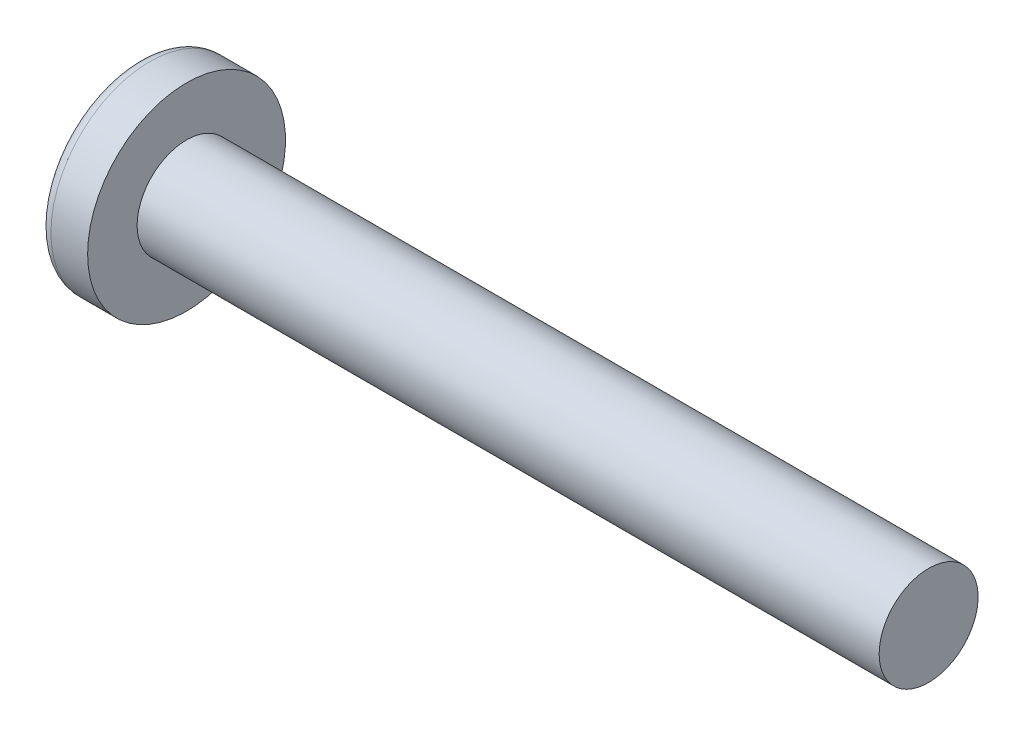
ISO-10303-21;
HEADER;
FILE_DESCRIPTION(('STEP AP214'),'2;1');
FILE_NAME('part.step','',(''),(''),'','','');
FILE_SCHEMA(('AUTOMOTIVE_DESIGN { 1 0 10303 214 1 1 1 1 }'));
ENDSEC;
DATA;
#1=APPLICATION_CONTEXT('core data for automotive mechanical design processes');
#2=APPLICATION_PROTOCOL_DEFINITION('international standard','automotive_design',2000,#1);
#3=PRODUCT_CONTEXT('',#1,'mechanical');
#4=PRODUCT('Part','Part','',(#3));
#5=PRODUCT_RELATED_PRODUCT_CATEGORY('part','',(#4));
#6=PRODUCT_DEFINITION_FORMATION('','',#4);
#7=PRODUCT_DEFINITION_CONTEXT('part definition',#1,'design');
#8=PRODUCT_DEFINITION('design','',#6,#7);
#9=PRODUCT_DEFINITION_SHAPE('','',#8);
#10=(LENGTH_UNIT() NAMED_UNIT(*) SI_UNIT(.MILLI.,.METRE.));
#11=(NAMED_UNIT(*) PLANE_ANGLE_UNIT() SI_UNIT($,.RADIAN.));
#12=(NAMED_UNIT(*) SI_UNIT($,.STERADIAN.) SOLID_ANGLE_UNIT());
#13=UNCERTAINTY_MEASURE_WITH_UNIT(LENGTH_MEASURE(1.E-05),#10,'distance_accuracy_value','');
#14=(GEOMETRIC_REPRESENTATION_CONTEXT(3) GLOBAL_UNCERTAINTY_ASSIGNED_CONTEXT((#13)) GLOBAL_UNIT_ASSIGNED_CONTEXT((#10,
#11,#12)) REPRESENTATION_CONTEXT('',''));
#15=CARTESIAN_POINT('',(0.,0.,0.));
#16=DIRECTION('',(0.,0.,1.));
#17=DIRECTION('',(1.,0.,0.));
#18=AXIS2_PLACEMENT_3D('',#15,#16,#17);
#19=CARTESIAN_POINT('',(6.5,0.,0.));
#20=DIRECTION('',(-1.,0.,0.));
#21=DIRECTION('',(0.,1.,0.));
#22=AXIS2_PLACEMENT_3D('',#19,#20,#21);
#23=SPHERICAL_SURFACE('',#22,6.5);
#24=CARTESIAN_POINT('',(1.22696010591455,0.,0.));
#25=DIRECTION('',(-1.,0.,0.));
#26=DIRECTION('',(0.,0.,1.));
#27=AXIS2_PLACEMENT_3D('',#24,#25,#26);
#28=CIRCLE('',#27,3.80066445182724);
#29=CARTESIAN_POINT('',(1.22696010591455,0.,3.80066445182724));
#30=VERTEX_POINT('',#29);
#31=EDGE_CURVE('E152',#30,#30,#28,.T.);
#32=ORIENTED_EDGE('',*,*,#31,.T.);
#33=EDGE_LOOP('',(#32));
#34=FACE_BOUND('',#33,.T.);
#35=CARTESIAN_POINT('',(6.48571960757402,-0.15048155459631,0.));
#36=DIRECTION('',(-0.0944735162161081,-0.995527375180494,0.));
#37=DIRECTION('',(0.995527375180495,-0.0944735162161082,0.));
#38=AXIS2_PLACEMENT_3D('',#35,#36,#37);
#39=CIRCLE('',#38,6.49824217555167);
#40=CARTESIAN_POINT('',(0.314004666074214,0.435201598015399,1.94783502836694));
#41=VERTEX_POINT('',#40);
#42=CARTESIAN_POINT('',(0.0329034112486444,0.461877533422321,0.461877533422322));
#43=VERTEX_POINT('',#42);
#44=EDGE_CURVE('E183',#41,#43,#39,.T.);
#45=ORIENTED_EDGE('',*,*,#44,.F.);
#46=CARTESIAN_POINT('',(5.02565375064329,0.,-1.83590765485334));
#47=DIRECTION('',(0.626149356629992,0.,0.779703137861998));
#48=DIRECTION('',(0.779703137861998,0.,-0.626149356629992));
#49=AXIS2_PLACEMENT_3D('',#46,#47,#48);
#50=CIRCLE('',#49,6.05852673674539);
#51=CARTESIAN_POINT('',(0.314004666074214,-0.435201598015413,1.94783502836693));
#52=VERTEX_POINT('',#51);
#53=EDGE_CURVE('E148',#41,#52,#50,.T.);
#54=ORIENTED_EDGE('',*,*,#53,.T.);
#55=CARTESIAN_POINT('',(6.48571960757402,0.15048155459631,0.));
#56=DIRECTION('',(-0.094473516216108,0.995527375180494,0.));
#57=DIRECTION('',(-0.995527375180495,-0.0944735162161081,0.));
#58=AXIS2_PLACEMENT_3D('',#55,#56,#57);
#59=CIRCLE('',#58,6.49824217555167);
#60=CARTESIAN_POINT('',(0.0329034112486444,-0.461877533422324,0.461877533422322));
#61=VERTEX_POINT('',#60);
#62=EDGE_CURVE('E104',#61,#52,#59,.T.);
#63=ORIENTED_EDGE('',*,*,#62,.F.);
#64=CARTESIAN_POINT('',(6.48571960757402,0.,-0.15048155459631));
#65=DIRECTION('',(-0.094473516216108,0.,-0.995527375180494));
#66=DIRECTION('',(-0.995527375180495,0.,0.0944735162161081));
#67=AXIS2_PLACEMENT_3D('',#64,#65,#66);
#68=CIRCLE('',#67,6.49824217555167);
#69=CARTESIAN_POINT('',(0.314004666074213,-1.94783502836693,0.435201598015406));
#70=VERTEX_POINT('',#69);
#71=EDGE_CURVE('E129',#70,#61,#68,.T.);
#72=ORIENTED_EDGE('',*,*,#71,.F.);
#73=CARTESIAN_POINT('',(5.02565375064329,1.83590765485334,0.));
#74=DIRECTION('',(0.626149356629992,-0.779703137861998,0.));
#75=DIRECTION('',(0.779703137861998,0.626149356629992,0.));
#76=AXIS2_PLACEMENT_3D('',#73,#74,#75);
#77=CIRCLE('',#76,6.05852673674539);
#78=CARTESIAN_POINT('',(0.314004666074213,-1.94783502836693,-0.435201598015406));
#79=VERTEX_POINT('',#78);
#80=EDGE_CURVE('E137',#70,#79,#77,.T.);
#81=ORIENTED_EDGE('',*,*,#80,.T.);
#82=CARTESIAN_POINT('',(6.48571960757402,0.,0.15048155459631));
#83=DIRECTION('',(-0.0944735162161081,0.,0.995527375180494));
#84=DIRECTION('',(0.995527375180495,0.,0.0944735162161082));
#85=AXIS2_PLACEMENT_3D('',#82,#83,#84);
#86=CIRCLE('',#85,6.49824217555167);
#87=CARTESIAN_POINT('',(0.0329034112486444,-0.461877533422321,-0.461877533422323));
#88=VERTEX_POINT('',#87);
#89=EDGE_CURVE('E47',#88,#79,#86,.T.);
#90=ORIENTED_EDGE('',*,*,#89,.F.);
#91=CARTESIAN_POINT('',(0.314004666074212,-0.435201598015399,-1.94783502836693));
#92=VERTEX_POINT('',#91);
#93=EDGE_CURVE('E190',#92,#88,#59,.T.);
#94=ORIENTED_EDGE('',*,*,#93,.F.);
#95=CARTESIAN_POINT('',(5.02565375064329,0.,1.83590765485334));
#96=DIRECTION('',(0.626149356629992,0.,-0.779703137861998));
#97=DIRECTION('',(-0.779703137861998,0.,-0.626149356629992));
#98=AXIS2_PLACEMENT_3D('',#95,#96,#97);
#99=CIRCLE('',#98,6.05852673674539);
#100=CARTESIAN_POINT('',(0.314004666074212,0.435201598015413,-1.94783502836693));
#101=VERTEX_POINT('',#100);
#102=EDGE_CURVE('E130',#92,#101,#99,.T.);
#103=ORIENTED_EDGE('',*,*,#102,.T.);
#104=CARTESIAN_POINT('',(0.0329034112486444,0.461877533422324,-0.461877533422323));
#105=VERTEX_POINT('',#104);
#106=EDGE_CURVE('E178',#105,#101,#39,.T.);
#107=ORIENTED_EDGE('',*,*,#106,.F.);
#108=CARTESIAN_POINT('',(0.314004666074213,1.94783502836693,-0.435201598015406));
#109=VERTEX_POINT('',#108);
#110=EDGE_CURVE('E40',#109,#105,#86,.T.);
#111=ORIENTED_EDGE('',*,*,#110,.F.);
#112=CARTESIAN_POINT('',(5.02565375064329,-1.83590765485334,0.));
#113=DIRECTION('',(0.626149356629992,0.779703137861998,0.));
#114=DIRECTION('',(-0.779703137861998,0.626149356629992,0.));
#115=AXIS2_PLACEMENT_3D('',#112,#113,#114);
#116=CIRCLE('',#115,6.05852673674539);
#117=CARTESIAN_POINT('',(0.314004666074214,1.94783502836693,0.435201598015406));
#118=VERTEX_POINT('',#117);
#119=EDGE_CURVE('E11',#109,#118,#116,.T.);
#120=ORIENTED_EDGE('',*,*,#119,.T.);
#121=EDGE_CURVE('E166',#43,#118,#68,.T.);
#122=ORIENTED_EDGE('',*,*,#121,.F.);
#123=EDGE_LOOP('',(#45,#54,#63,#72,#81,#90,#94,#103,#107,#111,#120,#122));
#124=FACE_BOUND('',#123,.T.);
#125=ADVANCED_FACE('F32',(#34,#124),#23,.T.);
#126=CARTESIAN_POINT('',(2.73951715374841,0.,-0.20502541296061));
#127=DIRECTION('',(-0.0944735162161081,0.,0.995527375180494));
#128=DIRECTION('',(0.995527375180495,0.,0.0944735162161082));
#129=AXIS2_PLACEMENT_3D('',#126,#127,#128);
#130=PLANE('',#129);
#131=ORIENTED_EDGE('',*,*,#110,.T.);
#132=DIRECTION('',(0.991114231601325,-0.0940547178968607,0.0940547178968604));
#133=VECTOR('',#132,1.);
#134=CARTESIAN_POINT('',(2.75862941145706,0.203211698708667,-0.203211698708667));
#135=LINE('',#134,#133);
#136=CARTESIAN_POINT('',(2.45,0.232500000000001,-0.232499999999999));
#137=VERTEX_POINT('',#136);
#138=EDGE_CURVE('E172',#105,#137,#135,.T.);
#139=ORIENTED_EDGE('',*,*,#138,.T.);
#140=DIRECTION('',(0.777577482844895,-0.624442325509114,0.0737905162291584));
#141=VECTOR('',#140,1.);
#142=CARTESIAN_POINT('',(0.,2.2,-0.465));
#143=LINE('',#142,#141);
#144=EDGE_CURVE('E153',#109,#137,#143,.T.);
#145=ORIENTED_EDGE('',*,*,#144,.F.);
#146=EDGE_LOOP('',(#131,#139,#145));
#147=FACE_BOUND('',#146,.T.);
#148=ADVANCED_FACE('F171',(#147),#130,.T.);
#149=DIRECTION('',(0.777577482844895,0.624442325509115,0.0737905162291584));
#150=VECTOR('',#149,1.);
#151=CARTESIAN_POINT('',(0.,-2.2,-0.465));
#152=LINE('',#151,#150);
#153=CARTESIAN_POINT('',(2.45,-0.2325,-0.2325));
#154=VERTEX_POINT('',#153);
#155=EDGE_CURVE('E138',#79,#154,#152,.T.);
#156=ORIENTED_EDGE('',*,*,#155,.T.);
#157=DIRECTION('',(-0.991114231601325,-0.09405471789686,-0.0940547178968604));
#158=VECTOR('',#157,1.);
#159=CARTESIAN_POINT('',(2.75862941145706,-0.203211698708666,-0.203211698708667));
#160=LINE('',#159,#158);
#161=EDGE_CURVE('E193',#154,#88,#160,.T.);
#162=ORIENTED_EDGE('',*,*,#161,.T.);
#163=ORIENTED_EDGE('',*,*,#89,.T.);
#164=EDGE_LOOP('',(#156,#162,#163));
#165=FACE_BOUND('',#164,.T.);
#166=ADVANCED_FACE('F208',(#165),#130,.T.);
#167=CARTESIAN_POINT('',(2.73951715374841,0.,0.20502541296061));
#168=DIRECTION('',(-0.094473516216108,0.,-0.995527375180494));
#169=DIRECTION('',(-0.995527375180495,0.,0.0944735162161081));
#170=AXIS2_PLACEMENT_3D('',#167,#168,#169);
#171=PLANE('',#170);
#172=DIRECTION('',(0.777577482844895,-0.624442325509115,-0.0737905162291584));
#173=VECTOR('',#172,1.);
#174=CARTESIAN_POINT('',(0.,2.2,0.465));
#175=LINE('',#174,#173);
#176=CARTESIAN_POINT('',(2.45,0.2325,0.2325));
#177=VERTEX_POINT('',#176);
#178=EDGE_CURVE('E209',#118,#177,#175,.T.);
#179=ORIENTED_EDGE('',*,*,#178,.T.);
#180=DIRECTION('',(-0.991114231601325,0.0940547178968601,0.0940547178968603));
#181=VECTOR('',#180,1.);
#182=CARTESIAN_POINT('',(2.75862941145706,0.203211698708666,0.203211698708667));
#183=LINE('',#182,#181);
#184=EDGE_CURVE('E187',#177,#43,#183,.T.);
#185=ORIENTED_EDGE('',*,*,#184,.T.);
#186=ORIENTED_EDGE('',*,*,#121,.T.);
#187=EDGE_LOOP('',(#179,#185,#186));
#188=FACE_BOUND('',#187,.T.);
#189=ADVANCED_FACE('F213',(#188),#171,.T.);
#190=ORIENTED_EDGE('',*,*,#71,.T.);
#191=DIRECTION('',(0.991114231601325,0.0940547178968606,-0.0940547178968603));
#192=VECTOR('',#191,1.);
#193=CARTESIAN_POINT('',(2.75862941145706,-0.203211698708668,0.203211698708667));
#194=LINE('',#193,#192);
#195=CARTESIAN_POINT('',(2.45,-0.232500000000001,0.232499999999999));
#196=VERTEX_POINT('',#195);
#197=EDGE_CURVE('E102',#61,#196,#194,.T.);
#198=ORIENTED_EDGE('',*,*,#197,.T.);
#199=DIRECTION('',(0.777577482844895,0.624442325509114,-0.0737905162291582));
#200=VECTOR('',#199,1.);
#201=CARTESIAN_POINT('',(0.,-2.2,0.464999999999999));
#202=LINE('',#201,#200);
#203=EDGE_CURVE('E127',#70,#196,#202,.T.);
#204=ORIENTED_EDGE('',*,*,#203,.F.);
#205=EDGE_LOOP('',(#190,#198,#204));
#206=FACE_BOUND('',#205,.T.);
#207=ADVANCED_FACE('F126',(#206),#171,.T.);
#208=CARTESIAN_POINT('',(-25.4,0.,0.));
#209=DIRECTION('',(-1.,0.,0.));
#210=DIRECTION('',(0.,0.,1.));
#211=AXIS2_PLACEMENT_3D('',#208,#209,#210);
#212=CYLINDRICAL_SURFACE('',#211,2.);
#213=CARTESIAN_POINT('',(33.1,0.,0.));
#214=DIRECTION('',(-1.,0.,0.));
#215=DIRECTION('',(0.,0.,1.));
#216=AXIS2_PLACEMENT_3D('',#213,#214,#215);
#217=CIRCLE('',#216,2.);
#218=CARTESIAN_POINT('',(33.1,0.,2.));
#219=VERTEX_POINT('',#218);
#220=EDGE_CURVE('E149',#219,#219,#217,.T.);
#221=ORIENTED_EDGE('',*,*,#220,.T.);
#222=EDGE_LOOP('',(#221));
#223=FACE_BOUND('',#222,.T.);
#224=CARTESIAN_POINT('',(3.1,0.,0.));
#225=DIRECTION('',(-1.,0.,0.));
#226=DIRECTION('',(0.,0.,1.));
#227=AXIS2_PLACEMENT_3D('',#224,#225,#226);
#228=CIRCLE('',#227,2.);
#229=CARTESIAN_POINT('',(3.1,0.,2.));
#230=VERTEX_POINT('',#229);
#231=EDGE_CURVE('E162',#230,#230,#228,.T.);
#232=ORIENTED_EDGE('',*,*,#231,.F.);
#233=EDGE_LOOP('',(#232));
#234=FACE_BOUND('',#233,.T.);
#235=ADVANCED_FACE('F34',(#223,#234),#212,.T.);
#236=CARTESIAN_POINT('',(3.1,2.,0.));
#237=DIRECTION('',(-1.,0.,0.));
#238=DIRECTION('',(0.,0.,1.));
#239=AXIS2_PLACEMENT_3D('',#236,#237,#238);
#240=PLANE('',#239);
#241=CARTESIAN_POINT('',(3.1,0.,0.));
#242=DIRECTION('',(-1.,0.,0.));
#243=DIRECTION('',(0.,0.,1.));
#244=AXIS2_PLACEMENT_3D('',#241,#242,#243);
#245=CIRCLE('',#244,4.);
#246=CARTESIAN_POINT('',(3.1,0.,4.));
#247=VERTEX_POINT('',#246);
#248=EDGE_CURVE('E159',#247,#247,#245,.T.);
#249=ORIENTED_EDGE('',*,*,#248,.F.);
#250=EDGE_LOOP('',(#249));
#251=FACE_BOUND('',#250,.T.);
#252=ORIENTED_EDGE('',*,*,#231,.T.);
#253=EDGE_LOOP('',(#252));
#254=FACE_BOUND('',#253,.T.);
#255=ADVANCED_FACE('F241',(#251,#254),#240,.F.);
#256=CARTESIAN_POINT('',(-25.4,0.,0.));
#257=DIRECTION('',(-1.,0.,0.));
#258=DIRECTION('',(0.,0.,1.));
#259=AXIS2_PLACEMENT_3D('',#256,#257,#258);
#260=CYLINDRICAL_SURFACE('',#259,4.);
#261=ORIENTED_EDGE('',*,*,#248,.T.);
#262=EDGE_LOOP('',(#261));
#263=FACE_BOUND('',#262,.T.);
#264=CARTESIAN_POINT('',(1.61635382117009,0.,0.));
#265=DIRECTION('',(-1.,0.,0.));
#266=DIRECTION('',(0.,0.,1.));
#267=AXIS2_PLACEMENT_3D('',#264,#265,#266);
#268=CIRCLE('',#267,4.);
#269=CARTESIAN_POINT('',(1.61635382117009,0.,4.));
#270=VERTEX_POINT('',#269);
#271=EDGE_CURVE('E156',#270,#270,#268,.T.);
#272=ORIENTED_EDGE('',*,*,#271,.F.);
#273=EDGE_LOOP('',(#272));
#274=FACE_BOUND('',#273,.T.);
#275=ADVANCED_FACE('F238',(#263,#274),#260,.T.);
#276=CARTESIAN_POINT('',(1.61635382117009,0.,0.));
#277=DIRECTION('',(-1.,0.,0.));
#278=DIRECTION('',(0.,0.,1.));
#279=AXIS2_PLACEMENT_3D('',#276,#277,#278);
#280=TOROIDAL_SURFACE('',#279,3.52,0.48);
#281=ORIENTED_EDGE('',*,*,#271,.T.);
#282=EDGE_LOOP('',(#281));
#283=FACE_BOUND('',#282,.T.);
#284=ORIENTED_EDGE('',*,*,#31,.F.);
#285=EDGE_LOOP('',(#284));
#286=FACE_BOUND('',#285,.T.);
#287=ADVANCED_FACE('F235',(#283,#286),#280,.T.);
#288=CARTESIAN_POINT('',(33.1,2.,0.));
#289=DIRECTION('',(1.,0.,0.));
#290=DIRECTION('',(0.,0.,-1.));
#291=AXIS2_PLACEMENT_3D('',#288,#289,#290);
#292=PLANE('',#291);
#293=ORIENTED_EDGE('',*,*,#220,.F.);
#294=EDGE_LOOP('',(#293));
#295=FACE_BOUND('',#294,.T.);
#296=ADVANCED_FACE('F233',(#295),#292,.T.);
#297=CARTESIAN_POINT('',(2.45,0.2325,0.2325));
#298=DIRECTION('',(0.626149356629992,0.779703137861998,0.));
#299=DIRECTION('',(-0.779703137861998,0.626149356629992,0.));
#300=AXIS2_PLACEMENT_3D('',#297,#298,#299);
#301=PLANE('',#300);
#302=ORIENTED_EDGE('',*,*,#144,.T.);
#303=DIRECTION('',(0.,0.,-1.));
#304=VECTOR('',#303,1.);
#305=CARTESIAN_POINT('',(2.45,0.2325,0.2325));
#306=LINE('',#305,#304);
#307=EDGE_CURVE('E120',#177,#137,#306,.T.);
#308=ORIENTED_EDGE('',*,*,#307,.F.);
#309=ORIENTED_EDGE('',*,*,#178,.F.);
#310=ORIENTED_EDGE('',*,*,#119,.F.);
#311=EDGE_LOOP('',(#302,#308,#309,#310));
#312=FACE_BOUND('',#311,.T.);
#313=ADVANCED_FACE('F212',(#312),#301,.F.);
#314=CARTESIAN_POINT('',(2.45,-0.2325,-0.2325));
#315=DIRECTION('',(0.626149356629992,-0.779703137861998,0.));
#316=DIRECTION('',(0.779703137861998,0.626149356629992,0.));
#317=AXIS2_PLACEMENT_3D('',#314,#315,#316);
#318=PLANE('',#317);
#319=ORIENTED_EDGE('',*,*,#203,.T.);
#320=DIRECTION('',(0.,0.,1.));
#321=VECTOR('',#320,1.);
#322=CARTESIAN_POINT('',(2.45,-0.2325,-0.2325));
#323=LINE('',#322,#321);
#324=EDGE_CURVE('E119',#154,#196,#323,.T.);
#325=ORIENTED_EDGE('',*,*,#324,.F.);
#326=ORIENTED_EDGE('',*,*,#155,.F.);
#327=ORIENTED_EDGE('',*,*,#80,.F.);
#328=EDGE_LOOP('',(#319,#325,#326,#327));
#329=FACE_BOUND('',#328,.T.);
#330=ADVANCED_FACE('F134',(#329),#318,.F.);
#331=CARTESIAN_POINT('',(2.45,0.2325,-0.2325));
#332=DIRECTION('',(-1.,0.,0.));
#333=DIRECTION('',(0.,0.,1.));
#334=AXIS2_PLACEMENT_3D('',#331,#332,#333);
#335=PLANE('',#334);
#336=DIRECTION('',(0.,1.,0.));
#337=VECTOR('',#336,1.);
#338=CARTESIAN_POINT('',(2.45,-0.2325,-0.2325));
#339=LINE('',#338,#337);
#340=EDGE_CURVE('E142',#154,#137,#339,.T.);
#341=ORIENTED_EDGE('',*,*,#340,.F.);
#342=ORIENTED_EDGE('',*,*,#324,.T.);
#343=DIRECTION('',(0.,-1.,0.));
#344=VECTOR('',#343,1.);
#345=CARTESIAN_POINT('',(2.45,0.2325,0.2325));
#346=LINE('',#345,#344);
#347=EDGE_CURVE('E111',#177,#196,#346,.T.);
#348=ORIENTED_EDGE('',*,*,#347,.F.);
#349=ORIENTED_EDGE('',*,*,#307,.T.);
#350=EDGE_LOOP('',(#341,#342,#348,#349));
#351=FACE_BOUND('',#350,.T.);
#352=ADVANCED_FACE('F140',(#351),#335,.T.);
#353=CARTESIAN_POINT('',(2.45,0.232500000000001,-0.232499999999999));
#354=DIRECTION('',(0.626149356629992,0.,-0.779703137861998));
#355=DIRECTION('',(0.779703137861998,0.,0.626149356629992));
#356=AXIS2_PLACEMENT_3D('',#353,#354,#355);
#357=PLANE('',#356);
#358=DIRECTION('',(0.777577482844895,0.0737905162291561,0.624442325509115));
#359=VECTOR('',#358,1.);
#360=CARTESIAN_POINT('',(0.,-0.464999999999992,-2.2));
#361=LINE('',#360,#359);
#362=EDGE_CURVE('E198',#92,#154,#361,.T.);
#363=ORIENTED_EDGE('',*,*,#362,.T.);
#364=ORIENTED_EDGE('',*,*,#340,.T.);
#365=DIRECTION('',(0.777577482844895,-0.0737905162291606,0.624442325509114));
#366=VECTOR('',#365,1.);
#367=CARTESIAN_POINT('',(0.,0.465000000000008,-2.2));
#368=LINE('',#367,#366);
#369=EDGE_CURVE('E108',#101,#137,#368,.T.);
#370=ORIENTED_EDGE('',*,*,#369,.F.);
#371=ORIENTED_EDGE('',*,*,#102,.F.);
#372=EDGE_LOOP('',(#363,#364,#370,#371));
#373=FACE_BOUND('',#372,.T.);
#374=ADVANCED_FACE('F203',(#373),#357,.F.);
#375=CARTESIAN_POINT('',(2.73951715374841,-0.20502541296061,0.));
#376=DIRECTION('',(-0.094473516216108,0.995527375180494,0.));
#377=DIRECTION('',(-0.995527375180495,-0.0944735162161081,0.));
#378=AXIS2_PLACEMENT_3D('',#375,#376,#377);
#379=PLANE('',#378);
#380=ORIENTED_EDGE('',*,*,#93,.T.);
#381=ORIENTED_EDGE('',*,*,#161,.F.);
#382=ORIENTED_EDGE('',*,*,#362,.F.);
#383=EDGE_LOOP('',(#380,#381,#382));
#384=FACE_BOUND('',#383,.T.);
#385=ADVANCED_FACE('F207',(#384),#379,.T.);
#386=CARTESIAN_POINT('',(2.73951715374841,0.20502541296061,0.));
#387=DIRECTION('',(-0.0944735162161081,-0.995527375180494,0.));
#388=DIRECTION('',(0.995527375180495,-0.0944735162161082,0.));
#389=AXIS2_PLACEMENT_3D('',#386,#387,#388);
#390=PLANE('',#389);
#391=ORIENTED_EDGE('',*,*,#106,.T.);
#392=ORIENTED_EDGE('',*,*,#369,.T.);
#393=ORIENTED_EDGE('',*,*,#138,.F.);
#394=EDGE_LOOP('',(#391,#392,#393));
#395=FACE_BOUND('',#394,.T.);
#396=ADVANCED_FACE('F201',(#395),#390,.T.);
#397=CARTESIAN_POINT('',(2.45,-0.232500000000001,0.232499999999999));
#398=DIRECTION('',(0.626149356629992,0.,0.779703137861998));
#399=DIRECTION('',(-0.779703137861998,0.,0.626149356629992));
#400=AXIS2_PLACEMENT_3D('',#397,#398,#399);
#401=PLANE('',#400);
#402=DIRECTION('',(0.777577482844895,-0.0737905162291562,-0.624442325509115));
#403=VECTOR('',#402,1.);
#404=CARTESIAN_POINT('',(0.,0.464999999999992,2.2));
#405=LINE('',#404,#403);
#406=EDGE_CURVE('E107',#41,#177,#405,.T.);
#407=ORIENTED_EDGE('',*,*,#406,.T.);
#408=ORIENTED_EDGE('',*,*,#347,.T.);
#409=DIRECTION('',(0.777577482844895,0.0737905162291606,-0.624442325509114));
#410=VECTOR('',#409,1.);
#411=CARTESIAN_POINT('',(0.,-0.465000000000008,2.2));
#412=LINE('',#411,#410);
#413=EDGE_CURVE('E98',#52,#196,#412,.T.);
#414=ORIENTED_EDGE('',*,*,#413,.F.);
#415=ORIENTED_EDGE('',*,*,#53,.F.);
#416=EDGE_LOOP('',(#407,#408,#414,#415));
#417=FACE_BOUND('',#416,.T.);
#418=ADVANCED_FACE('F112',(#417),#401,.F.);
#419=ORIENTED_EDGE('',*,*,#44,.T.);
#420=ORIENTED_EDGE('',*,*,#184,.F.);
#421=ORIENTED_EDGE('',*,*,#406,.F.);
#422=EDGE_LOOP('',(#419,#420,#421));
#423=FACE_BOUND('',#422,.T.);
#424=ADVANCED_FACE('F214',(#423),#390,.T.);
#425=ORIENTED_EDGE('',*,*,#62,.T.);
#426=ORIENTED_EDGE('',*,*,#413,.T.);
#427=ORIENTED_EDGE('',*,*,#197,.F.);
#428=EDGE_LOOP('',(#425,#426,#427));
#429=FACE_BOUND('',#428,.T.);
#430=ADVANCED_FACE('F100',(#429),#379,.T.);
#431=CLOSED_SHELL('',(#125,#148,#166,#189,#207,#235,#255,#275,#287,#296,#313,#330,#352,#374,
#385,#396,#418,#424,#430));
#432=MANIFOLD_SOLID_BREP('B2',#431);
#433=ADVANCED_BREP_SHAPE_REPRESENTATION('',(#18,#432),#14);
#434=SHAPE_DEFINITION_REPRESENTATION(#9,#433);
ENDSEC;
END-ISO-10303-21;
